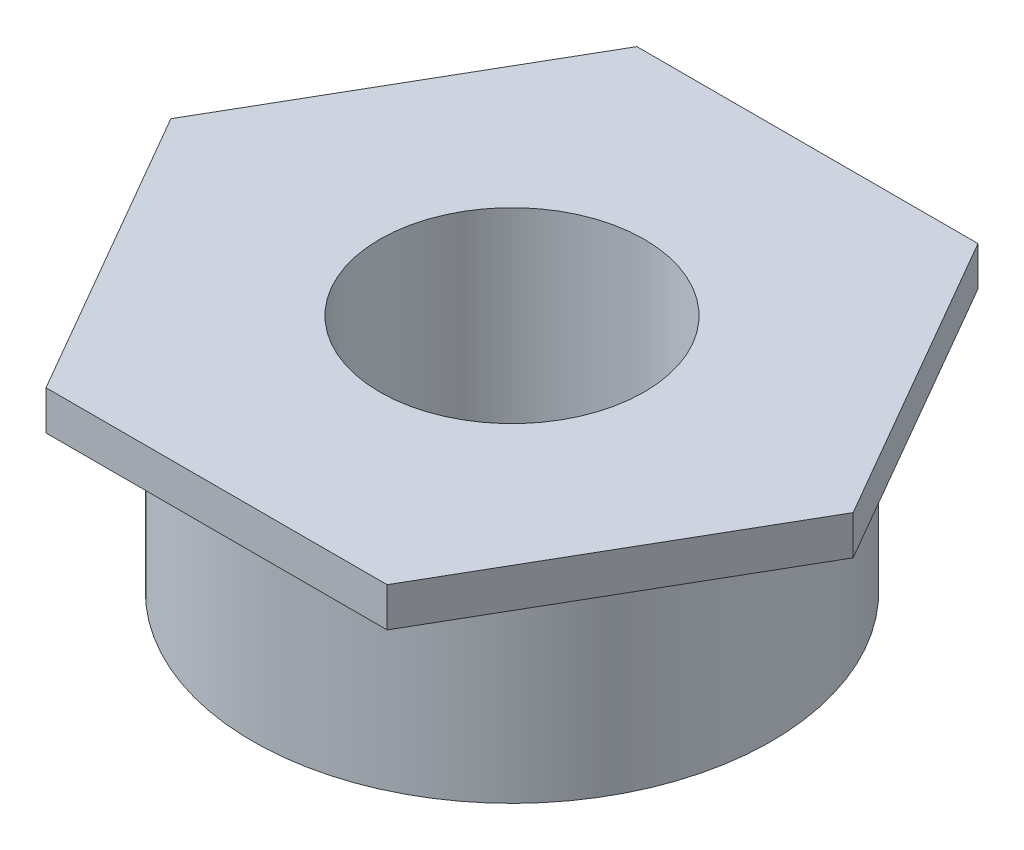
ISO-10303-21;
HEADER;
FILE_DESCRIPTION(('STEP AP214'),'2;1');
FILE_NAME('part.step','',(''),(''),'','','');
FILE_SCHEMA(('AUTOMOTIVE_DESIGN { 1 0 10303 214 1 1 1 1 }'));
ENDSEC;
DATA;
#1=APPLICATION_CONTEXT('core data for automotive mechanical design processes');
#2=APPLICATION_PROTOCOL_DEFINITION('international standard','automotive_design',2000,#1);
#3=PRODUCT_CONTEXT('',#1,'mechanical');
#4=PRODUCT('Part','Part','',(#3));
#5=PRODUCT_RELATED_PRODUCT_CATEGORY('part','',(#4));
#6=PRODUCT_DEFINITION_FORMATION('','',#4);
#7=PRODUCT_DEFINITION_CONTEXT('part definition',#1,'design');
#8=PRODUCT_DEFINITION('design','',#6,#7);
#9=PRODUCT_DEFINITION_SHAPE('','',#8);
#10=(LENGTH_UNIT() NAMED_UNIT(*) SI_UNIT(.MILLI.,.METRE.));
#11=(NAMED_UNIT(*) PLANE_ANGLE_UNIT() SI_UNIT($,.RADIAN.));
#12=(NAMED_UNIT(*) SI_UNIT($,.STERADIAN.) SOLID_ANGLE_UNIT());
#13=UNCERTAINTY_MEASURE_WITH_UNIT(LENGTH_MEASURE(1.E-05),#10,'distance_accuracy_value','');
#14=(GEOMETRIC_REPRESENTATION_CONTEXT(3) GLOBAL_UNCERTAINTY_ASSIGNED_CONTEXT((#13)) GLOBAL_UNIT_ASSIGNED_CONTEXT((#10,
#11,#12)) REPRESENTATION_CONTEXT('',''));
#15=CARTESIAN_POINT('',(0.,0.,0.));
#16=DIRECTION('',(0.,0.,1.));
#17=DIRECTION('',(1.,0.,0.));
#18=AXIS2_PLACEMENT_3D('',#15,#16,#17);
#19=CARTESIAN_POINT('',(-3.20790243318486,0.,5.55625));
#20=DIRECTION('',(0.,1.,0.));
#21=DIRECTION('',(0.,0.,1.));
#22=AXIS2_PLACEMENT_3D('',#19,#20,#21);
#23=PLANE('',#22);
#24=DIRECTION('',(-1.,0.,0.));
#25=VECTOR('',#24,1.);
#26=CARTESIAN_POINT('',(3.20790243318486,0.,-5.55625));
#27=LINE('',#26,#25);
#28=CARTESIAN_POINT('',(-3.20790243318486,0.,-5.55625));
#29=VERTEX_POINT('',#28);
#30=CARTESIAN_POINT('',(3.20790243318486,0.,-5.55625));
#31=VERTEX_POINT('',#30);
#32=EDGE_CURVE('E120',#29,#31,#27,.F.);
#33=ORIENTED_EDGE('',*,*,#32,.F.);
#34=DIRECTION('',(-0.5,0.,0.866025403784439));
#35=VECTOR('',#34,1.);
#36=CARTESIAN_POINT('',(-3.20790243318486,0.,-5.55625));
#37=LINE('',#36,#35);
#38=CARTESIAN_POINT('',(-6.41580486636972,0.,0.));
#39=VERTEX_POINT('',#38);
#40=EDGE_CURVE('E114',#39,#29,#37,.F.);
#41=ORIENTED_EDGE('',*,*,#40,.F.);
#42=DIRECTION('',(0.5,0.,0.866025403784439));
#43=VECTOR('',#42,1.);
#44=CARTESIAN_POINT('',(-6.41580486636972,0.,0.));
#45=LINE('',#44,#43);
#46=CARTESIAN_POINT('',(-3.20790243318486,0.,5.55625));
#47=VERTEX_POINT('',#46);
#48=EDGE_CURVE('E75',#47,#39,#45,.F.);
#49=ORIENTED_EDGE('',*,*,#48,.F.);
#50=DIRECTION('',(1.,0.,0.));
#51=VECTOR('',#50,1.);
#52=CARTESIAN_POINT('',(-3.20790243318486,0.,5.55625));
#53=LINE('',#52,#51);
#54=CARTESIAN_POINT('',(3.20790243318486,0.,5.55625));
#55=VERTEX_POINT('',#54);
#56=EDGE_CURVE('E71',#55,#47,#53,.F.);
#57=ORIENTED_EDGE('',*,*,#56,.F.);
#58=DIRECTION('',(0.5,0.,-0.866025403784439));
#59=VECTOR('',#58,1.);
#60=CARTESIAN_POINT('',(3.20790243318486,0.,5.55625));
#61=LINE('',#60,#59);
#62=CARTESIAN_POINT('',(6.41580486636972,0.,0.));
#63=VERTEX_POINT('',#62);
#64=EDGE_CURVE('E68',#63,#55,#61,.F.);
#65=ORIENTED_EDGE('',*,*,#64,.F.);
#66=DIRECTION('',(-0.5,0.,-0.866025403784439));
#67=VECTOR('',#66,1.);
#68=CARTESIAN_POINT('',(6.41580486636972,0.,0.));
#69=LINE('',#68,#67);
#70=EDGE_CURVE('E86',#31,#63,#69,.F.);
#71=ORIENTED_EDGE('',*,*,#70,.F.);
#72=EDGE_LOOP('',(#33,#41,#49,#57,#65,#71));
#73=FACE_BOUND('',#72,.T.);
#74=CARTESIAN_POINT('',(0.,0.,0.));
#75=DIRECTION('',(0.,-1.,0.));
#76=DIRECTION('',(0.,0.,-1.));
#77=AXIS2_PLACEMENT_3D('',#74,#75,#76);
#78=CIRCLE('',#77,2.48793);
#79=CARTESIAN_POINT('',(0.,0.,-2.48793));
#80=VERTEX_POINT('',#79);
#81=EDGE_CURVE('E20',#80,#80,#78,.T.);
#82=ORIENTED_EDGE('',*,*,#81,.T.);
#83=EDGE_LOOP('',(#82));
#84=FACE_BOUND('',#83,.T.);
#85=ADVANCED_FACE('F17',(#73,#84),#23,.T.);
#86=CARTESIAN_POINT('',(0.,-4.4958,0.));
#87=DIRECTION('',(0.,-1.,0.));
#88=DIRECTION('',(0.,0.,-1.));
#89=AXIS2_PLACEMENT_3D('',#86,#87,#88);
#90=CYLINDRICAL_SURFACE('',#89,2.48793);
#91=CARTESIAN_POINT('',(0.,-4.4958,0.));
#92=DIRECTION('',(0.,-1.,0.));
#93=DIRECTION('',(0.,0.,-1.));
#94=AXIS2_PLACEMENT_3D('',#91,#92,#93);
#95=CIRCLE('',#94,2.48793);
#96=CARTESIAN_POINT('',(0.,-4.4958,-2.48793));
#97=VERTEX_POINT('',#96);
#98=EDGE_CURVE('E97',#97,#97,#95,.T.);
#99=ORIENTED_EDGE('',*,*,#98,.T.);
#100=EDGE_LOOP('',(#99));
#101=FACE_BOUND('',#100,.T.);
#102=ORIENTED_EDGE('',*,*,#81,.F.);
#103=EDGE_LOOP('',(#102));
#104=FACE_BOUND('',#103,.T.);
#105=ADVANCED_FACE('F208',(#101,#104),#90,.F.);
#106=CARTESIAN_POINT('',(-3.20790243318486,-0.7366,5.55625));
#107=DIRECTION('',(0.,0.,1.));
#108=DIRECTION('',(1.,0.,0.));
#109=AXIS2_PLACEMENT_3D('',#106,#107,#108);
#110=PLANE('',#109);
#111=DIRECTION('',(1.,0.,0.));
#112=VECTOR('',#111,1.);
#113=CARTESIAN_POINT('',(-3.20790243318486,-0.7366,5.55625));
#114=LINE('',#113,#112);
#115=CARTESIAN_POINT('',(-3.20790243318486,-0.7366,5.55625));
#116=VERTEX_POINT('',#115);
#117=CARTESIAN_POINT('',(3.20790243318486,-0.7366,5.55625));
#118=VERTEX_POINT('',#117);
#119=EDGE_CURVE('E83',#116,#118,#114,.T.);
#120=ORIENTED_EDGE('',*,*,#119,.T.);
#121=DIRECTION('',(0.,1.,0.));
#122=VECTOR('',#121,1.);
#123=CARTESIAN_POINT('',(3.20790243318486,-0.7366,5.55625));
#124=LINE('',#123,#122);
#125=EDGE_CURVE('E80',#55,#118,#124,.F.);
#126=ORIENTED_EDGE('',*,*,#125,.F.);
#127=ORIENTED_EDGE('',*,*,#56,.T.);
#128=DIRECTION('',(0.,1.,0.));
#129=VECTOR('',#128,1.);
#130=CARTESIAN_POINT('',(-3.20790243318486,-0.7366,5.55625));
#131=LINE('',#130,#129);
#132=EDGE_CURVE('E99',#116,#47,#131,.T.);
#133=ORIENTED_EDGE('',*,*,#132,.F.);
#134=EDGE_LOOP('',(#120,#126,#127,#133));
#135=FACE_BOUND('',#134,.T.);
#136=ADVANCED_FACE('F81',(#135),#110,.T.);
#137=CARTESIAN_POINT('',(3.20790243318486,-0.7366,5.55625));
#138=DIRECTION('',(0.866025403784439,0.,0.5));
#139=DIRECTION('',(0.5,0.,-0.866025403784439));
#140=AXIS2_PLACEMENT_3D('',#137,#138,#139);
#141=PLANE('',#140);
#142=DIRECTION('',(0.5,0.,-0.866025403784438));
#143=VECTOR('',#142,1.);
#144=CARTESIAN_POINT('',(3.20790243318486,-0.7366,5.55625));
#145=LINE('',#144,#143);
#146=CARTESIAN_POINT('',(6.41580486636972,-0.7366,0.));
#147=VERTEX_POINT('',#146);
#148=EDGE_CURVE('E102',#118,#147,#145,.T.);
#149=ORIENTED_EDGE('',*,*,#148,.T.);
#150=DIRECTION('',(0.,1.,0.));
#151=VECTOR('',#150,1.);
#152=CARTESIAN_POINT('',(6.41580486636972,-0.7366,0.));
#153=LINE('',#152,#151);
#154=EDGE_CURVE('E90',#63,#147,#153,.F.);
#155=ORIENTED_EDGE('',*,*,#154,.F.);
#156=ORIENTED_EDGE('',*,*,#64,.T.);
#157=ORIENTED_EDGE('',*,*,#125,.T.);
#158=EDGE_LOOP('',(#149,#155,#156,#157));
#159=FACE_BOUND('',#158,.T.);
#160=ADVANCED_FACE('F88',(#159),#141,.T.);
#161=CARTESIAN_POINT('',(6.41580486636972,-0.7366,0.));
#162=DIRECTION('',(0.866025403784439,0.,-0.5));
#163=DIRECTION('',(-0.5,0.,-0.866025403784439));
#164=AXIS2_PLACEMENT_3D('',#161,#162,#163);
#165=PLANE('',#164);
#166=DIRECTION('',(-0.5,0.,-0.866025403784439));
#167=VECTOR('',#166,1.);
#168=CARTESIAN_POINT('',(6.41580486636972,-0.7366,0.));
#169=LINE('',#168,#167);
#170=CARTESIAN_POINT('',(3.20790243318486,-0.7366,-5.55625));
#171=VERTEX_POINT('',#170);
#172=EDGE_CURVE('E165',#147,#171,#169,.T.);
#173=ORIENTED_EDGE('',*,*,#172,.T.);
#174=DIRECTION('',(0.,1.,0.));
#175=VECTOR('',#174,1.);
#176=CARTESIAN_POINT('',(3.20790243318486,-0.7366,-5.55625));
#177=LINE('',#176,#175);
#178=EDGE_CURVE('E117',#31,#171,#177,.F.);
#179=ORIENTED_EDGE('',*,*,#178,.F.);
#180=ORIENTED_EDGE('',*,*,#70,.T.);
#181=ORIENTED_EDGE('',*,*,#154,.T.);
#182=EDGE_LOOP('',(#173,#179,#180,#181));
#183=FACE_BOUND('',#182,.T.);
#184=ADVANCED_FACE('F125',(#183),#165,.T.);
#185=CARTESIAN_POINT('',(3.20790243318486,-0.7366,-5.55625));
#186=DIRECTION('',(0.,0.,-1.));
#187=DIRECTION('',(-1.,0.,0.));
#188=AXIS2_PLACEMENT_3D('',#185,#186,#187);
#189=PLANE('',#188);
#190=DIRECTION('',(1.,0.,0.));
#191=VECTOR('',#190,1.);
#192=CARTESIAN_POINT('',(-3.20790243318486,-0.7366,-5.55625));
#193=LINE('',#192,#191);
#194=CARTESIAN_POINT('',(-3.20790243318486,-0.7366,-5.55625));
#195=VERTEX_POINT('',#194);
#196=EDGE_CURVE('E131',#171,#195,#193,.F.);
#197=ORIENTED_EDGE('',*,*,#196,.T.);
#198=DIRECTION('',(0.,1.,0.));
#199=VECTOR('',#198,1.);
#200=CARTESIAN_POINT('',(-3.20790243318486,-0.7366,-5.55625));
#201=LINE('',#200,#199);
#202=EDGE_CURVE('E112',#29,#195,#201,.F.);
#203=ORIENTED_EDGE('',*,*,#202,.F.);
#204=ORIENTED_EDGE('',*,*,#32,.T.);
#205=ORIENTED_EDGE('',*,*,#178,.T.);
#206=EDGE_LOOP('',(#197,#203,#204,#205));
#207=FACE_BOUND('',#206,.T.);
#208=ADVANCED_FACE('F129',(#207),#189,.T.);
#209=CARTESIAN_POINT('',(-3.20790243318486,-0.7366,-5.55625));
#210=DIRECTION('',(-0.866025403784439,0.,-0.5));
#211=DIRECTION('',(-0.5,0.,0.866025403784439));
#212=AXIS2_PLACEMENT_3D('',#209,#210,#211);
#213=PLANE('',#212);
#214=DIRECTION('',(-0.5,0.,0.866025403784438));
#215=VECTOR('',#214,1.);
#216=CARTESIAN_POINT('',(-3.20790243318486,-0.7366,-5.55625));
#217=LINE('',#216,#215);
#218=CARTESIAN_POINT('',(-6.41580486636972,-0.7366,0.));
#219=VERTEX_POINT('',#218);
#220=EDGE_CURVE('E35',#195,#219,#217,.T.);
#221=ORIENTED_EDGE('',*,*,#220,.T.);
#222=DIRECTION('',(0.,1.,0.));
#223=VECTOR('',#222,1.);
#224=CARTESIAN_POINT('',(-6.41580486636972,-0.7366,0.));
#225=LINE('',#224,#223);
#226=EDGE_CURVE('E104',#39,#219,#225,.F.);
#227=ORIENTED_EDGE('',*,*,#226,.F.);
#228=ORIENTED_EDGE('',*,*,#40,.T.);
#229=ORIENTED_EDGE('',*,*,#202,.T.);
#230=EDGE_LOOP('',(#221,#227,#228,#229));
#231=FACE_BOUND('',#230,.T.);
#232=ADVANCED_FACE('F132',(#231),#213,.T.);
#233=CARTESIAN_POINT('',(-6.41580486636972,-0.7366,0.));
#234=DIRECTION('',(-0.866025403784439,0.,0.5));
#235=DIRECTION('',(0.5,0.,0.866025403784439));
#236=AXIS2_PLACEMENT_3D('',#233,#234,#235);
#237=PLANE('',#236);
#238=DIRECTION('',(0.5,0.,0.866025403784439));
#239=VECTOR('',#238,1.);
#240=CARTESIAN_POINT('',(-6.41580486636972,-0.7366,0.));
#241=LINE('',#240,#239);
#242=EDGE_CURVE('E96',#219,#116,#241,.T.);
#243=ORIENTED_EDGE('',*,*,#242,.T.);
#244=ORIENTED_EDGE('',*,*,#132,.T.);
#245=ORIENTED_EDGE('',*,*,#48,.T.);
#246=ORIENTED_EDGE('',*,*,#226,.T.);
#247=EDGE_LOOP('',(#243,#244,#245,#246));
#248=FACE_BOUND('',#247,.T.);
#249=ADVANCED_FACE('F134',(#248),#237,.T.);
#250=CARTESIAN_POINT('',(0.,-4.4958,0.));
#251=DIRECTION('',(0.,1.,0.));
#252=DIRECTION('',(0.,0.,1.));
#253=AXIS2_PLACEMENT_3D('',#250,#251,#252);
#254=PLANE('',#253);
#255=CARTESIAN_POINT('',(0.,-4.4958,0.));
#256=DIRECTION('',(0.,-1.,0.));
#257=DIRECTION('',(0.,0.,-1.));
#258=AXIS2_PLACEMENT_3D('',#255,#256,#257);
#259=CIRCLE('',#258,4.8768);
#260=CARTESIAN_POINT('',(0.,-4.4958,-4.8768));
#261=VERTEX_POINT('',#260);
#262=EDGE_CURVE('E26',#261,#261,#259,.F.);
#263=ORIENTED_EDGE('',*,*,#262,.F.);
#264=EDGE_LOOP('',(#263));
#265=FACE_BOUND('',#264,.T.);
#266=ORIENTED_EDGE('',*,*,#98,.F.);
#267=EDGE_LOOP('',(#266));
#268=FACE_BOUND('',#267,.T.);
#269=ADVANCED_FACE('F136',(#265,#268),#254,.F.);
#270=CARTESIAN_POINT('',(-3.20790243318486,-0.7366,5.55625));
#271=DIRECTION('',(0.,1.,0.));
#272=DIRECTION('',(0.,0.,1.));
#273=AXIS2_PLACEMENT_3D('',#270,#271,#272);
#274=PLANE('',#273);
#275=ORIENTED_EDGE('',*,*,#220,.F.);
#276=ORIENTED_EDGE('',*,*,#196,.F.);
#277=ORIENTED_EDGE('',*,*,#172,.F.);
#278=ORIENTED_EDGE('',*,*,#148,.F.);
#279=ORIENTED_EDGE('',*,*,#119,.F.);
#280=ORIENTED_EDGE('',*,*,#242,.F.);
#281=EDGE_LOOP('',(#275,#276,#277,#278,#279,#280));
#282=FACE_BOUND('',#281,.T.);
#283=CARTESIAN_POINT('',(0.,-0.7366,0.));
#284=DIRECTION('',(0.,-1.,0.));
#285=DIRECTION('',(0.,0.,-1.));
#286=AXIS2_PLACEMENT_3D('',#283,#284,#285);
#287=CIRCLE('',#286,4.8768);
#288=CARTESIAN_POINT('',(0.,-0.7366,-4.8768));
#289=VERTEX_POINT('',#288);
#290=EDGE_CURVE('E11',#289,#289,#287,.T.);
#291=ORIENTED_EDGE('',*,*,#290,.F.);
#292=EDGE_LOOP('',(#291));
#293=FACE_BOUND('',#292,.T.);
#294=ADVANCED_FACE('F143',(#282,#293),#274,.F.);
#295=CARTESIAN_POINT('',(0.,-4.4958,0.));
#296=DIRECTION('',(0.,-1.,0.));
#297=DIRECTION('',(0.,0.,-1.));
#298=AXIS2_PLACEMENT_3D('',#295,#296,#297);
#299=CYLINDRICAL_SURFACE('',#298,4.8768);
#300=ORIENTED_EDGE('',*,*,#290,.T.);
#301=EDGE_LOOP('',(#300));
#302=FACE_BOUND('',#301,.T.);
#303=ORIENTED_EDGE('',*,*,#262,.T.);
#304=EDGE_LOOP('',(#303));
#305=FACE_BOUND('',#304,.T.);
#306=ADVANCED_FACE('F147',(#302,#305),#299,.T.);
#307=CLOSED_SHELL('',(#85,#105,#136,#160,#184,#208,#232,#249,#269,#294,#306));
#308=MANIFOLD_SOLID_BREP('B1',#307);
#309=ADVANCED_BREP_SHAPE_REPRESENTATION('',(#18,#308),#14);
#310=SHAPE_DEFINITION_REPRESENTATION(#9,#309);
ENDSEC;
END-ISO-10303-21;
